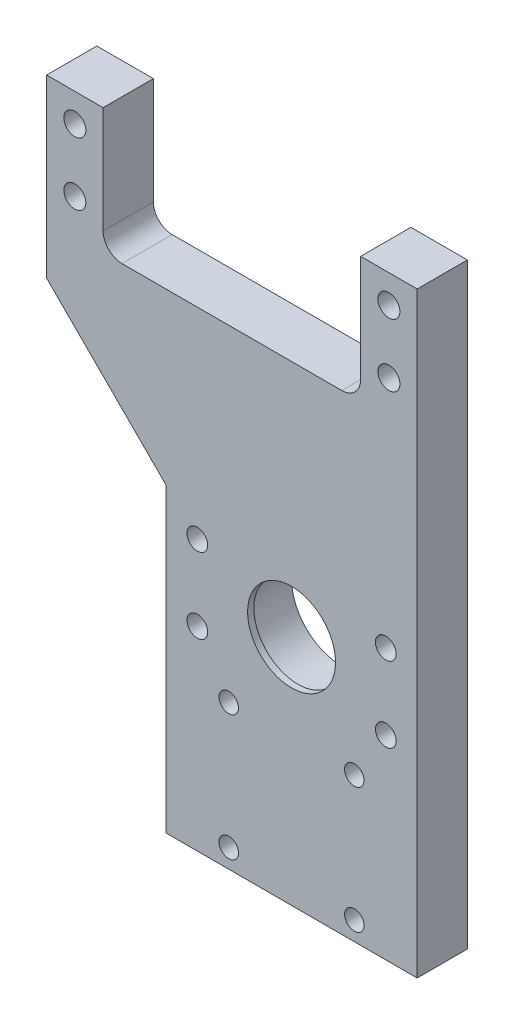
ISO-10303-21;
HEADER;
FILE_DESCRIPTION(('STEP AP214'),'2;1');
FILE_NAME('part.step','',(''),(''),'','','');
FILE_SCHEMA(('AUTOMOTIVE_DESIGN { 1 0 10303 214 1 1 1 1 }'));
ENDSEC;
DATA;
#1=APPLICATION_CONTEXT('core data for automotive mechanical design processes');
#2=APPLICATION_PROTOCOL_DEFINITION('international standard','automotive_design',2000,#1);
#3=PRODUCT_CONTEXT('',#1,'mechanical');
#4=PRODUCT('Part','Part','',(#3));
#5=PRODUCT_RELATED_PRODUCT_CATEGORY('part','',(#4));
#6=PRODUCT_DEFINITION_FORMATION('','',#4);
#7=PRODUCT_DEFINITION_CONTEXT('part definition',#1,'design');
#8=PRODUCT_DEFINITION('design','',#6,#7);
#9=PRODUCT_DEFINITION_SHAPE('','',#8);
#10=(LENGTH_UNIT() NAMED_UNIT(*) SI_UNIT(.MILLI.,.METRE.));
#11=(NAMED_UNIT(*) PLANE_ANGLE_UNIT() SI_UNIT($,.RADIAN.));
#12=(NAMED_UNIT(*) SI_UNIT($,.STERADIAN.) SOLID_ANGLE_UNIT());
#13=UNCERTAINTY_MEASURE_WITH_UNIT(LENGTH_MEASURE(1.E-05),#10,'distance_accuracy_value','');
#14=(GEOMETRIC_REPRESENTATION_CONTEXT(3) GLOBAL_UNCERTAINTY_ASSIGNED_CONTEXT((#13)) GLOBAL_UNIT_ASSIGNED_CONTEXT((#10,
#11,#12)) REPRESENTATION_CONTEXT('',''));
#15=CARTESIAN_POINT('',(0.,0.,0.));
#16=DIRECTION('',(0.,0.,1.));
#17=DIRECTION('',(1.,0.,0.));
#18=AXIS2_PLACEMENT_3D('',#15,#16,#17);
#19=CARTESIAN_POINT('',(0.,0.,8.));
#20=DIRECTION('',(1.,0.,0.));
#21=DIRECTION('',(0.,0.,-1.));
#22=AXIS2_PLACEMENT_3D('',#19,#20,#21);
#23=PLANE('',#22);
#24=DIRECTION('',(0.,-1.,0.));
#25=VECTOR('',#24,1.);
#26=CARTESIAN_POINT('',(0.,0.,8.));
#27=LINE('',#26,#25);
#28=CARTESIAN_POINT('',(0.,26.,8.));
#29=VERTEX_POINT('',#28);
#30=CARTESIAN_POINT('',(0.,-22.,8.));
#31=VERTEX_POINT('',#30);
#32=EDGE_CURVE('E223',#29,#31,#27,.T.);
#33=ORIENTED_EDGE('',*,*,#32,.F.);
#34=DIRECTION('',(0.,0.,-1.));
#35=VECTOR('',#34,1.);
#36=CARTESIAN_POINT('',(0.,26.,8.));
#37=LINE('',#36,#35);
#38=CARTESIAN_POINT('',(0.,26.,0.));
#39=VERTEX_POINT('',#38);
#40=EDGE_CURVE('E228',#29,#39,#37,.T.);
#41=ORIENTED_EDGE('',*,*,#40,.T.);
#42=DIRECTION('',(0.,-1.,0.));
#43=VECTOR('',#42,1.);
#44=CARTESIAN_POINT('',(0.,0.,0.));
#45=LINE('',#44,#43);
#46=CARTESIAN_POINT('',(0.,-22.,0.));
#47=VERTEX_POINT('',#46);
#48=EDGE_CURVE('E220',#39,#47,#45,.T.);
#49=ORIENTED_EDGE('',*,*,#48,.T.);
#50=DIRECTION('',(0.,0.,1.));
#51=VECTOR('',#50,1.);
#52=CARTESIAN_POINT('',(0.,-22.,0.));
#53=LINE('',#52,#51);
#54=EDGE_CURVE('E208',#47,#31,#53,.T.);
#55=ORIENTED_EDGE('',*,*,#54,.T.);
#56=EDGE_LOOP('',(#33,#41,#49,#55));
#57=FACE_BOUND('',#56,.T.);
#58=ADVANCED_FACE('F32',(#57),#23,.F.);
#59=CARTESIAN_POINT('',(40.,0.,8.));
#60=DIRECTION('',(-1.,0.,0.));
#61=DIRECTION('',(0.,0.,1.));
#62=AXIS2_PLACEMENT_3D('',#59,#60,#61);
#63=PLANE('',#62);
#64=DIRECTION('',(0.,1.,0.));
#65=VECTOR('',#64,1.);
#66=CARTESIAN_POINT('',(40.,0.,0.));
#67=LINE('',#66,#65);
#68=CARTESIAN_POINT('',(40.,-22.,0.));
#69=VERTEX_POINT('',#68);
#70=CARTESIAN_POINT('',(40.,73.,0.));
#71=VERTEX_POINT('',#70);
#72=EDGE_CURVE('E226',#69,#71,#67,.T.);
#73=ORIENTED_EDGE('',*,*,#72,.T.);
#74=DIRECTION('',(0.,0.,1.));
#75=VECTOR('',#74,1.);
#76=CARTESIAN_POINT('',(40.,73.,0.));
#77=LINE('',#76,#75);
#78=CARTESIAN_POINT('',(40.,73.,8.));
#79=VERTEX_POINT('',#78);
#80=EDGE_CURVE('E175',#71,#79,#77,.T.);
#81=ORIENTED_EDGE('',*,*,#80,.T.);
#82=DIRECTION('',(0.,1.,0.));
#83=VECTOR('',#82,1.);
#84=CARTESIAN_POINT('',(40.,0.,8.));
#85=LINE('',#84,#83);
#86=CARTESIAN_POINT('',(40.,-22.,8.));
#87=VERTEX_POINT('',#86);
#88=EDGE_CURVE('E225',#87,#79,#85,.T.);
#89=ORIENTED_EDGE('',*,*,#88,.F.);
#90=DIRECTION('',(0.,0.,1.));
#91=VECTOR('',#90,1.);
#92=CARTESIAN_POINT('',(40.,-22.,0.));
#93=LINE('',#92,#91);
#94=EDGE_CURVE('E211',#69,#87,#93,.T.);
#95=ORIENTED_EDGE('',*,*,#94,.F.);
#96=EDGE_LOOP('',(#73,#81,#89,#95));
#97=FACE_BOUND('',#96,.T.);
#98=ADVANCED_FACE('F266',(#97),#63,.F.);
#99=CARTESIAN_POINT('',(0.,0.,8.));
#100=DIRECTION('',(0.,0.,-1.));
#101=DIRECTION('',(-1.,0.,0.));
#102=AXIS2_PLACEMENT_3D('',#99,#100,#101);
#103=PLANE('',#102);
#104=CARTESIAN_POINT('',(5.,21.,8.));
#105=DIRECTION('',(0.,0.,-1.));
#106=DIRECTION('',(1.,0.,0.));
#107=AXIS2_PLACEMENT_3D('',#104,#105,#106);
#108=CIRCLE('',#107,1.65);
#109=CARTESIAN_POINT('',(6.65,21.,8.));
#110=VERTEX_POINT('',#109);
#111=EDGE_CURVE('E398',#110,#110,#108,.T.);
#112=ORIENTED_EDGE('',*,*,#111,.T.);
#113=EDGE_LOOP('',(#112));
#114=FACE_BOUND('',#113,.T.);
#115=CARTESIAN_POINT('',(5.,9.00000000000001,8.));
#116=DIRECTION('',(0.,0.,-1.));
#117=DIRECTION('',(-1.,0.,0.));
#118=AXIS2_PLACEMENT_3D('',#115,#116,#117);
#119=CIRCLE('',#118,1.65);
#120=CARTESIAN_POINT('',(3.34999999999999,9.00000000000001,8.));
#121=VERTEX_POINT('',#120);
#122=EDGE_CURVE('E402',#121,#121,#119,.T.);
#123=ORIENTED_EDGE('',*,*,#122,.T.);
#124=EDGE_LOOP('',(#123));
#125=FACE_BOUND('',#124,.T.);
#126=CARTESIAN_POINT('',(35.,9.00000000000001,8.));
#127=DIRECTION('',(0.,0.,-1.));
#128=DIRECTION('',(1.,0.,0.));
#129=AXIS2_PLACEMENT_3D('',#126,#127,#128);
#130=CIRCLE('',#129,1.65);
#131=CARTESIAN_POINT('',(36.65,9.00000000000001,8.));
#132=VERTEX_POINT('',#131);
#133=EDGE_CURVE('E412',#132,#132,#130,.T.);
#134=ORIENTED_EDGE('',*,*,#133,.T.);
#135=EDGE_LOOP('',(#134));
#136=FACE_BOUND('',#135,.T.);
#137=CARTESIAN_POINT('',(35.,21.,8.));
#138=DIRECTION('',(0.,0.,-1.));
#139=DIRECTION('',(-1.,0.,0.));
#140=AXIS2_PLACEMENT_3D('',#137,#138,#139);
#141=CIRCLE('',#140,1.65);
#142=CARTESIAN_POINT('',(33.35,21.,8.));
#143=VERTEX_POINT('',#142);
#144=EDGE_CURVE('E418',#143,#143,#141,.T.);
#145=ORIENTED_EDGE('',*,*,#144,.T.);
#146=EDGE_LOOP('',(#145));
#147=FACE_BOUND('',#146,.T.);
#148=CARTESIAN_POINT('',(20.,15.,8.));
#149=DIRECTION('',(0.,0.,-1.));
#150=DIRECTION('',(-1.,0.,0.));
#151=AXIS2_PLACEMENT_3D('',#148,#149,#150);
#152=CIRCLE('',#151,7.);
#153=CARTESIAN_POINT('',(13.,15.,8.));
#154=VERTEX_POINT('',#153);
#155=EDGE_CURVE('E436',#154,#154,#152,.T.);
#156=ORIENTED_EDGE('',*,*,#155,.T.);
#157=EDGE_LOOP('',(#156));
#158=FACE_BOUND('',#157,.T.);
#159=CARTESIAN_POINT('',(35.5,68.5,8.));
#160=DIRECTION('',(0.,0.,1.));
#161=DIRECTION('',(-1.,0.,0.));
#162=AXIS2_PLACEMENT_3D('',#159,#160,#161);
#163=CIRCLE('',#162,1.75);
#164=CARTESIAN_POINT('',(33.75,68.5,8.));
#165=VERTEX_POINT('',#164);
#166=EDGE_CURVE('E446',#165,#165,#163,.T.);
#167=ORIENTED_EDGE('',*,*,#166,.F.);
#168=EDGE_LOOP('',(#167));
#169=FACE_BOUND('',#168,.T.);
#170=CARTESIAN_POINT('',(-14.5,68.5,8.));
#171=DIRECTION('',(0.,0.,1.));
#172=DIRECTION('',(1.,0.,0.));
#173=AXIS2_PLACEMENT_3D('',#170,#171,#172);
#174=CIRCLE('',#173,1.75);
#175=CARTESIAN_POINT('',(-12.75,68.5,8.));
#176=VERTEX_POINT('',#175);
#177=EDGE_CURVE('E452',#176,#176,#174,.T.);
#178=ORIENTED_EDGE('',*,*,#177,.F.);
#179=EDGE_LOOP('',(#178));
#180=FACE_BOUND('',#179,.T.);
#181=CARTESIAN_POINT('',(-14.5,58.5,8.));
#182=DIRECTION('',(0.,0.,1.));
#183=DIRECTION('',(-1.,0.,0.));
#184=AXIS2_PLACEMENT_3D('',#181,#182,#183);
#185=CIRCLE('',#184,1.75);
#186=CARTESIAN_POINT('',(-16.25,58.5,8.));
#187=VERTEX_POINT('',#186);
#188=EDGE_CURVE('E439',#187,#187,#185,.T.);
#189=ORIENTED_EDGE('',*,*,#188,.F.);
#190=EDGE_LOOP('',(#189));
#191=FACE_BOUND('',#190,.T.);
#192=CARTESIAN_POINT('',(35.5,58.5,8.));
#193=DIRECTION('',(0.,0.,1.));
#194=DIRECTION('',(1.,0.,0.));
#195=AXIS2_PLACEMENT_3D('',#192,#193,#194);
#196=CIRCLE('',#195,1.75);
#197=CARTESIAN_POINT('',(37.25,58.5,8.));
#198=VERTEX_POINT('',#197);
#199=EDGE_CURVE('E445',#198,#198,#196,.T.);
#200=ORIENTED_EDGE('',*,*,#199,.F.);
#201=EDGE_LOOP('',(#200));
#202=FACE_BOUND('',#201,.T.);
#203=CARTESIAN_POINT('',(30.,1.,8.));
#204=DIRECTION('',(0.,0.,1.));
#205=DIRECTION('',(-1.,0.,0.));
#206=AXIS2_PLACEMENT_3D('',#203,#204,#205);
#207=CIRCLE('',#206,1.54999999999999);
#208=CARTESIAN_POINT('',(28.45,1.,8.));
#209=VERTEX_POINT('',#208);
#210=EDGE_CURVE('E185',#209,#209,#207,.T.);
#211=ORIENTED_EDGE('',*,*,#210,.F.);
#212=EDGE_LOOP('',(#211));
#213=FACE_BOUND('',#212,.T.);
#214=CARTESIAN_POINT('',(10.,1.,8.));
#215=DIRECTION('',(0.,0.,1.));
#216=DIRECTION('',(1.,0.,0.));
#217=AXIS2_PLACEMENT_3D('',#214,#215,#216);
#218=CIRCLE('',#217,1.55);
#219=CARTESIAN_POINT('',(11.55,1.,8.));
#220=VERTEX_POINT('',#219);
#221=EDGE_CURVE('E191',#220,#220,#218,.T.);
#222=ORIENTED_EDGE('',*,*,#221,.F.);
#223=EDGE_LOOP('',(#222));
#224=FACE_BOUND('',#223,.T.);
#225=CARTESIAN_POINT('',(10.,-19.,8.));
#226=DIRECTION('',(0.,0.,1.));
#227=DIRECTION('',(-1.,0.,0.));
#228=AXIS2_PLACEMENT_3D('',#225,#226,#227);
#229=CIRCLE('',#228,1.55);
#230=CARTESIAN_POINT('',(8.45,-19.,8.));
#231=VERTEX_POINT('',#230);
#232=EDGE_CURVE('E180',#231,#231,#229,.T.);
#233=ORIENTED_EDGE('',*,*,#232,.F.);
#234=EDGE_LOOP('',(#233));
#235=FACE_BOUND('',#234,.T.);
#236=CARTESIAN_POINT('',(30.,-19.,8.));
#237=DIRECTION('',(0.,0.,1.));
#238=DIRECTION('',(1.,0.,0.));
#239=AXIS2_PLACEMENT_3D('',#236,#237,#238);
#240=CIRCLE('',#239,1.54999999999999);
#241=CARTESIAN_POINT('',(31.55,-19.,8.));
#242=VERTEX_POINT('',#241);
#243=EDGE_CURVE('E184',#242,#242,#240,.T.);
#244=ORIENTED_EDGE('',*,*,#243,.F.);
#245=EDGE_LOOP('',(#244));
#246=FACE_BOUND('',#245,.T.);
#247=DIRECTION('',(-1.,0.,0.));
#248=VECTOR('',#247,1.);
#249=CARTESIAN_POINT('',(0.,73.,8.));
#250=LINE('',#249,#248);
#251=CARTESIAN_POINT('',(31.,73.,8.));
#252=VERTEX_POINT('',#251);
#253=EDGE_CURVE('E171',#79,#252,#250,.T.);
#254=ORIENTED_EDGE('',*,*,#253,.T.);
#255=DIRECTION('',(0.,1.,0.));
#256=VECTOR('',#255,1.);
#257=CARTESIAN_POINT('',(31.,73.,8.));
#258=LINE('',#257,#256);
#259=CARTESIAN_POINT('',(31.,56.,8.));
#260=VERTEX_POINT('',#259);
#261=EDGE_CURVE('E163',#260,#252,#258,.T.);
#262=ORIENTED_EDGE('',*,*,#261,.F.);
#263=CARTESIAN_POINT('',(28.,56.,8.));
#264=DIRECTION('',(0.,0.,-1.));
#265=DIRECTION('',(-1.,0.,0.));
#266=AXIS2_PLACEMENT_3D('',#263,#264,#265);
#267=CIRCLE('',#266,3.);
#268=CARTESIAN_POINT('',(28.,53.,8.));
#269=VERTEX_POINT('',#268);
#270=EDGE_CURVE('E40',#260,#269,#267,.T.);
#271=ORIENTED_EDGE('',*,*,#270,.T.);
#272=DIRECTION('',(1.,0.,0.));
#273=VECTOR('',#272,1.);
#274=CARTESIAN_POINT('',(0.,53.,8.));
#275=LINE('',#274,#273);
#276=CARTESIAN_POINT('',(-6.99999999999999,53.,8.));
#277=VERTEX_POINT('',#276);
#278=EDGE_CURVE('E158',#277,#269,#275,.T.);
#279=ORIENTED_EDGE('',*,*,#278,.F.);
#280=CARTESIAN_POINT('',(-6.99999999999999,56.,8.));
#281=DIRECTION('',(0.,0.,-1.));
#282=DIRECTION('',(-1.,0.,0.));
#283=AXIS2_PLACEMENT_3D('',#280,#281,#282);
#284=CIRCLE('',#283,3.);
#285=CARTESIAN_POINT('',(-9.99999999999999,56.,8.));
#286=VERTEX_POINT('',#285);
#287=EDGE_CURVE('E244',#277,#286,#284,.T.);
#288=ORIENTED_EDGE('',*,*,#287,.T.);
#289=DIRECTION('',(0.,1.,0.));
#290=VECTOR('',#289,1.);
#291=CARTESIAN_POINT('',(-9.99999999999999,53.,8.));
#292=LINE('',#291,#290);
#293=CARTESIAN_POINT('',(-9.99999999999999,73.,8.));
#294=VERTEX_POINT('',#293);
#295=EDGE_CURVE('E149',#286,#294,#292,.T.);
#296=ORIENTED_EDGE('',*,*,#295,.T.);
#297=DIRECTION('',(-1.,0.,0.));
#298=VECTOR('',#297,1.);
#299=CARTESIAN_POINT('',(-9.99999999999999,73.,8.));
#300=LINE('',#299,#298);
#301=CARTESIAN_POINT('',(-19.,73.,8.));
#302=VERTEX_POINT('',#301);
#303=EDGE_CURVE('E137',#294,#302,#300,.T.);
#304=ORIENTED_EDGE('',*,*,#303,.T.);
#305=DIRECTION('',(0.,-1.,0.));
#306=VECTOR('',#305,1.);
#307=CARTESIAN_POINT('',(-19.,73.,8.));
#308=LINE('',#307,#306);
#309=CARTESIAN_POINT('',(-19.,45.,8.));
#310=VERTEX_POINT('',#309);
#311=EDGE_CURVE('E131',#302,#310,#308,.T.);
#312=ORIENTED_EDGE('',*,*,#311,.T.);
#313=DIRECTION('',(0.707106781186551,-0.707106781186544,0.));
#314=VECTOR('',#313,1.);
#315=CARTESIAN_POINT('',(13.,13.0000000000002,8.));
#316=LINE('',#315,#314);
#317=EDGE_CURVE('E232',#310,#29,#316,.T.);
#318=ORIENTED_EDGE('',*,*,#317,.T.);
#319=ORIENTED_EDGE('',*,*,#32,.T.);
#320=DIRECTION('',(1.,0.,0.));
#321=VECTOR('',#320,1.);
#322=CARTESIAN_POINT('',(0.,-22.,8.));
#323=LINE('',#322,#321);
#324=EDGE_CURVE('E202',#31,#87,#323,.T.);
#325=ORIENTED_EDGE('',*,*,#324,.T.);
#326=ORIENTED_EDGE('',*,*,#88,.T.);
#327=EDGE_LOOP('',(#254,#262,#271,#279,#288,#296,#304,#312,#318,#319,#325,#326));
#328=FACE_BOUND('',#327,.T.);
#329=ADVANCED_FACE('F250',(#114,#125,#136,#147,#158,#169,#180,#191,#202,#213,#224,#235,#246,
#328),#103,.F.);
#330=CARTESIAN_POINT('',(0.,0.,0.));
#331=DIRECTION('',(0.,0.,-1.));
#332=DIRECTION('',(-1.,0.,0.));
#333=AXIS2_PLACEMENT_3D('',#330,#331,#332);
#334=PLANE('',#333);
#335=CARTESIAN_POINT('',(5.,21.,0.));
#336=DIRECTION('',(0.,0.,-1.));
#337=DIRECTION('',(1.,0.,0.));
#338=AXIS2_PLACEMENT_3D('',#335,#336,#337);
#339=CIRCLE('',#338,1.65);
#340=CARTESIAN_POINT('',(6.65,21.,0.));
#341=VERTEX_POINT('',#340);
#342=EDGE_CURVE('E401',#341,#341,#339,.T.);
#343=ORIENTED_EDGE('',*,*,#342,.F.);
#344=EDGE_LOOP('',(#343));
#345=FACE_BOUND('',#344,.T.);
#346=CARTESIAN_POINT('',(5.,9.00000000000001,0.));
#347=DIRECTION('',(0.,0.,-1.));
#348=DIRECTION('',(-1.,0.,0.));
#349=AXIS2_PLACEMENT_3D('',#346,#347,#348);
#350=CIRCLE('',#349,1.65);
#351=CARTESIAN_POINT('',(3.34999999999999,9.00000000000001,0.));
#352=VERTEX_POINT('',#351);
#353=EDGE_CURVE('E407',#352,#352,#350,.T.);
#354=ORIENTED_EDGE('',*,*,#353,.F.);
#355=EDGE_LOOP('',(#354));
#356=FACE_BOUND('',#355,.T.);
#357=CARTESIAN_POINT('',(35.,9.00000000000001,0.));
#358=DIRECTION('',(0.,0.,-1.));
#359=DIRECTION('',(1.,0.,0.));
#360=AXIS2_PLACEMENT_3D('',#357,#358,#359);
#361=CIRCLE('',#360,1.65);
#362=CARTESIAN_POINT('',(36.65,9.00000000000001,0.));
#363=VERTEX_POINT('',#362);
#364=EDGE_CURVE('E415',#363,#363,#361,.T.);
#365=ORIENTED_EDGE('',*,*,#364,.F.);
#366=EDGE_LOOP('',(#365));
#367=FACE_BOUND('',#366,.T.);
#368=CARTESIAN_POINT('',(35.,21.,0.));
#369=DIRECTION('',(0.,0.,-1.));
#370=DIRECTION('',(-1.,0.,0.));
#371=AXIS2_PLACEMENT_3D('',#368,#369,#370);
#372=CIRCLE('',#371,1.65);
#373=CARTESIAN_POINT('',(33.35,21.,0.));
#374=VERTEX_POINT('',#373);
#375=EDGE_CURVE('E404',#374,#374,#372,.T.);
#376=ORIENTED_EDGE('',*,*,#375,.F.);
#377=EDGE_LOOP('',(#376));
#378=FACE_BOUND('',#377,.T.);
#379=CARTESIAN_POINT('',(35.5,68.5,0.));
#380=DIRECTION('',(0.,0.,1.));
#381=DIRECTION('',(-1.,0.,0.));
#382=AXIS2_PLACEMENT_3D('',#379,#380,#381);
#383=CIRCLE('',#382,1.75);
#384=CARTESIAN_POINT('',(33.75,68.5,0.));
#385=VERTEX_POINT('',#384);
#386=EDGE_CURVE('E442',#385,#385,#383,.T.);
#387=ORIENTED_EDGE('',*,*,#386,.T.);
#388=EDGE_LOOP('',(#387));
#389=FACE_BOUND('',#388,.T.);
#390=CARTESIAN_POINT('',(-14.5,68.5,0.));
#391=DIRECTION('',(0.,0.,1.));
#392=DIRECTION('',(1.,0.,0.));
#393=AXIS2_PLACEMENT_3D('',#390,#391,#392);
#394=CIRCLE('',#393,1.75);
#395=CARTESIAN_POINT('',(-12.75,68.5,0.));
#396=VERTEX_POINT('',#395);
#397=EDGE_CURVE('E449',#396,#396,#394,.T.);
#398=ORIENTED_EDGE('',*,*,#397,.T.);
#399=EDGE_LOOP('',(#398));
#400=FACE_BOUND('',#399,.T.);
#401=CARTESIAN_POINT('',(-14.5,58.5,0.));
#402=DIRECTION('',(0.,0.,1.));
#403=DIRECTION('',(-1.,0.,0.));
#404=AXIS2_PLACEMENT_3D('',#401,#402,#403);
#405=CIRCLE('',#404,1.75);
#406=CARTESIAN_POINT('',(-16.25,58.5,0.));
#407=VERTEX_POINT('',#406);
#408=EDGE_CURVE('E455',#407,#407,#405,.T.);
#409=ORIENTED_EDGE('',*,*,#408,.T.);
#410=EDGE_LOOP('',(#409));
#411=FACE_BOUND('',#410,.T.);
#412=CARTESIAN_POINT('',(35.5,58.5,0.));
#413=DIRECTION('',(0.,0.,1.));
#414=DIRECTION('',(1.,0.,0.));
#415=AXIS2_PLACEMENT_3D('',#412,#413,#414);
#416=CIRCLE('',#415,1.75);
#417=CARTESIAN_POINT('',(37.25,58.5,0.));
#418=VERTEX_POINT('',#417);
#419=EDGE_CURVE('E151',#418,#418,#416,.T.);
#420=ORIENTED_EDGE('',*,*,#419,.T.);
#421=EDGE_LOOP('',(#420));
#422=FACE_BOUND('',#421,.T.);
#423=DIRECTION('',(1.,0.,0.));
#424=VECTOR('',#423,1.);
#425=CARTESIAN_POINT('',(0.,53.,0.));
#426=LINE('',#425,#424);
#427=CARTESIAN_POINT('',(-6.99999999999999,53.,0.));
#428=VERTEX_POINT('',#427);
#429=CARTESIAN_POINT('',(28.,53.,0.));
#430=VERTEX_POINT('',#429);
#431=EDGE_CURVE('E160',#428,#430,#426,.T.);
#432=ORIENTED_EDGE('',*,*,#431,.T.);
#433=CARTESIAN_POINT('',(28.,56.,0.));
#434=DIRECTION('',(0.,0.,-1.));
#435=DIRECTION('',(-1.,0.,0.));
#436=AXIS2_PLACEMENT_3D('',#433,#434,#435);
#437=CIRCLE('',#436,3.);
#438=CARTESIAN_POINT('',(31.,56.,0.));
#439=VERTEX_POINT('',#438);
#440=EDGE_CURVE('E11',#430,#439,#437,.F.);
#441=ORIENTED_EDGE('',*,*,#440,.T.);
#442=DIRECTION('',(0.,1.,0.));
#443=VECTOR('',#442,1.);
#444=CARTESIAN_POINT('',(31.,73.,0.));
#445=LINE('',#444,#443);
#446=CARTESIAN_POINT('',(31.,73.,0.));
#447=VERTEX_POINT('',#446);
#448=EDGE_CURVE('E162',#439,#447,#445,.T.);
#449=ORIENTED_EDGE('',*,*,#448,.T.);
#450=DIRECTION('',(-1.,0.,0.));
#451=VECTOR('',#450,1.);
#452=CARTESIAN_POINT('',(0.,73.,0.));
#453=LINE('',#452,#451);
#454=EDGE_CURVE('E172',#71,#447,#453,.T.);
#455=ORIENTED_EDGE('',*,*,#454,.F.);
#456=ORIENTED_EDGE('',*,*,#72,.F.);
#457=DIRECTION('',(1.,0.,0.));
#458=VECTOR('',#457,1.);
#459=CARTESIAN_POINT('',(0.,-22.,0.));
#460=LINE('',#459,#458);
#461=EDGE_CURVE('E205',#47,#69,#460,.T.);
#462=ORIENTED_EDGE('',*,*,#461,.F.);
#463=ORIENTED_EDGE('',*,*,#48,.F.);
#464=DIRECTION('',(-0.707106781186551,0.707106781186544,0.));
#465=VECTOR('',#464,1.);
#466=CARTESIAN_POINT('',(-19.0000000000001,45.,0.));
#467=LINE('',#466,#465);
#468=CARTESIAN_POINT('',(-19.,45.,0.));
#469=VERTEX_POINT('',#468);
#470=EDGE_CURVE('E234',#39,#469,#467,.T.);
#471=ORIENTED_EDGE('',*,*,#470,.T.);
#472=DIRECTION('',(0.,-1.,0.));
#473=VECTOR('',#472,1.);
#474=CARTESIAN_POINT('',(-19.,73.,0.));
#475=LINE('',#474,#473);
#476=CARTESIAN_POINT('',(-19.,73.,0.));
#477=VERTEX_POINT('',#476);
#478=EDGE_CURVE('E139',#477,#469,#475,.T.);
#479=ORIENTED_EDGE('',*,*,#478,.F.);
#480=DIRECTION('',(-1.,0.,0.));
#481=VECTOR('',#480,1.);
#482=CARTESIAN_POINT('',(-9.99999999999999,73.,0.));
#483=LINE('',#482,#481);
#484=CARTESIAN_POINT('',(-9.99999999999999,73.,0.));
#485=VERTEX_POINT('',#484);
#486=EDGE_CURVE('E130',#485,#477,#483,.T.);
#487=ORIENTED_EDGE('',*,*,#486,.F.);
#488=DIRECTION('',(0.,1.,0.));
#489=VECTOR('',#488,1.);
#490=CARTESIAN_POINT('',(-9.99999999999999,53.,0.));
#491=LINE('',#490,#489);
#492=CARTESIAN_POINT('',(-9.99999999999999,56.,0.));
#493=VERTEX_POINT('',#492);
#494=EDGE_CURVE('E120',#493,#485,#491,.T.);
#495=ORIENTED_EDGE('',*,*,#494,.F.);
#496=CARTESIAN_POINT('',(-6.99999999999999,56.,0.));
#497=DIRECTION('',(0.,0.,-1.));
#498=DIRECTION('',(-1.,0.,0.));
#499=AXIS2_PLACEMENT_3D('',#496,#497,#498);
#500=CIRCLE('',#499,3.);
#501=EDGE_CURVE('E246',#493,#428,#500,.F.);
#502=ORIENTED_EDGE('',*,*,#501,.T.);
#503=EDGE_LOOP('',(#432,#441,#449,#455,#456,#462,#463,#471,#479,#487,#495,#502));
#504=FACE_BOUND('',#503,.T.);
#505=CARTESIAN_POINT('',(30.,1.,0.));
#506=DIRECTION('',(0.,0.,1.));
#507=DIRECTION('',(-1.,0.,0.));
#508=AXIS2_PLACEMENT_3D('',#505,#506,#507);
#509=CIRCLE('',#508,1.54999999999999);
#510=CARTESIAN_POINT('',(28.45,1.,0.));
#511=VERTEX_POINT('',#510);
#512=EDGE_CURVE('E181',#511,#511,#509,.T.);
#513=ORIENTED_EDGE('',*,*,#512,.T.);
#514=EDGE_LOOP('',(#513));
#515=FACE_BOUND('',#514,.T.);
#516=CARTESIAN_POINT('',(10.,1.,0.));
#517=DIRECTION('',(0.,0.,1.));
#518=DIRECTION('',(1.,0.,0.));
#519=AXIS2_PLACEMENT_3D('',#516,#517,#518);
#520=CIRCLE('',#519,1.55);
#521=CARTESIAN_POINT('',(11.55,1.,0.));
#522=VERTEX_POINT('',#521);
#523=EDGE_CURVE('E188',#522,#522,#520,.T.);
#524=ORIENTED_EDGE('',*,*,#523,.T.);
#525=EDGE_LOOP('',(#524));
#526=FACE_BOUND('',#525,.T.);
#527=CARTESIAN_POINT('',(10.,-19.,0.));
#528=DIRECTION('',(0.,0.,1.));
#529=DIRECTION('',(-1.,0.,0.));
#530=AXIS2_PLACEMENT_3D('',#527,#528,#529);
#531=CIRCLE('',#530,1.55);
#532=CARTESIAN_POINT('',(8.45,-19.,0.));
#533=VERTEX_POINT('',#532);
#534=EDGE_CURVE('E194',#533,#533,#531,.T.);
#535=ORIENTED_EDGE('',*,*,#534,.T.);
#536=EDGE_LOOP('',(#535));
#537=FACE_BOUND('',#536,.T.);
#538=CARTESIAN_POINT('',(30.,-19.,0.));
#539=DIRECTION('',(0.,0.,1.));
#540=DIRECTION('',(1.,0.,0.));
#541=AXIS2_PLACEMENT_3D('',#538,#539,#540);
#542=CIRCLE('',#541,1.54999999999999);
#543=CARTESIAN_POINT('',(31.55,-19.,0.));
#544=VERTEX_POINT('',#543);
#545=EDGE_CURVE('E199',#544,#544,#542,.T.);
#546=ORIENTED_EDGE('',*,*,#545,.T.);
#547=EDGE_LOOP('',(#546));
#548=FACE_BOUND('',#547,.T.);
#549=CARTESIAN_POINT('',(20.,15.,0.));
#550=DIRECTION('',(0.,0.,1.));
#551=DIRECTION('',(1.,0.,0.));
#552=AXIS2_PLACEMENT_3D('',#549,#550,#551);
#553=CIRCLE('',#552,8.);
#554=CARTESIAN_POINT('',(28.,15.,0.));
#555=VERTEX_POINT('',#554);
#556=EDGE_CURVE('E214',#555,#555,#553,.T.);
#557=ORIENTED_EDGE('',*,*,#556,.T.);
#558=EDGE_LOOP('',(#557));
#559=FACE_BOUND('',#558,.T.);
#560=ADVANCED_FACE('F142',(#345,#356,#367,#378,#389,#400,#411,#422,#504,#515,#526,#537,#548,
#559),#334,.T.);
#561=CARTESIAN_POINT('',(20.,15.,7.));
#562=DIRECTION('',(0.,0.,-1.));
#563=DIRECTION('',(-1.,0.,0.));
#564=AXIS2_PLACEMENT_3D('',#561,#562,#563);
#565=CYLINDRICAL_SURFACE('',#564,8.);
#566=CARTESIAN_POINT('',(20.,15.,7.));
#567=DIRECTION('',(0.,0.,1.));
#568=DIRECTION('',(1.,0.,0.));
#569=AXIS2_PLACEMENT_3D('',#566,#567,#568);
#570=CIRCLE('',#569,8.);
#571=CARTESIAN_POINT('',(28.,15.,7.));
#572=VERTEX_POINT('',#571);
#573=EDGE_CURVE('E217',#572,#572,#570,.T.);
#574=ORIENTED_EDGE('',*,*,#573,.T.);
#575=EDGE_LOOP('',(#574));
#576=FACE_BOUND('',#575,.T.);
#577=ORIENTED_EDGE('',*,*,#556,.F.);
#578=EDGE_LOOP('',(#577));
#579=FACE_BOUND('',#578,.T.);
#580=ADVANCED_FACE('F300',(#576,#579),#565,.F.);
#581=CARTESIAN_POINT('',(20.,15.,7.));
#582=DIRECTION('',(0.,0.,1.));
#583=DIRECTION('',(1.,0.,0.));
#584=AXIS2_PLACEMENT_3D('',#581,#582,#583);
#585=PLANE('',#584);
#586=CARTESIAN_POINT('',(20.,15.,7.));
#587=DIRECTION('',(0.,0.,-1.));
#588=DIRECTION('',(-1.,0.,0.));
#589=AXIS2_PLACEMENT_3D('',#586,#587,#588);
#590=CIRCLE('',#589,7.);
#591=CARTESIAN_POINT('',(13.,15.,7.));
#592=VERTEX_POINT('',#591);
#593=EDGE_CURVE('E433',#592,#592,#590,.T.);
#594=ORIENTED_EDGE('',*,*,#593,.F.);
#595=EDGE_LOOP('',(#594));
#596=FACE_BOUND('',#595,.T.);
#597=ORIENTED_EDGE('',*,*,#573,.F.);
#598=EDGE_LOOP('',(#597));
#599=FACE_BOUND('',#598,.T.);
#600=ADVANCED_FACE('F307',(#596,#599),#585,.F.);
#601=CARTESIAN_POINT('',(0.,-22.,0.));
#602=DIRECTION('',(0.,-1.,0.));
#603=DIRECTION('',(0.,0.,-1.));
#604=AXIS2_PLACEMENT_3D('',#601,#602,#603);
#605=PLANE('',#604);
#606=CARTESIAN_POINT('',(36.,-22.,4.));
#607=DIRECTION('',(0.,-1.,0.));
#608=DIRECTION('',(0.,0.,-1.));
#609=AXIS2_PLACEMENT_3D('',#606,#607,#608);
#610=CIRCLE('',#609,1.65);
#611=CARTESIAN_POINT('',(36.,-22.,2.35));
#612=VERTEX_POINT('',#611);
#613=EDGE_CURVE('E421',#612,#612,#610,.T.);
#614=ORIENTED_EDGE('',*,*,#613,.F.);
#615=EDGE_LOOP('',(#614));
#616=FACE_BOUND('',#615,.T.);
#617=CARTESIAN_POINT('',(20.,-22.,4.));
#618=DIRECTION('',(0.,-1.,0.));
#619=DIRECTION('',(0.,0.,-1.));
#620=AXIS2_PLACEMENT_3D('',#617,#618,#619);
#621=CIRCLE('',#620,1.65);
#622=CARTESIAN_POINT('',(20.,-22.,2.35));
#623=VERTEX_POINT('',#622);
#624=EDGE_CURVE('E427',#623,#623,#621,.T.);
#625=ORIENTED_EDGE('',*,*,#624,.F.);
#626=EDGE_LOOP('',(#625));
#627=FACE_BOUND('',#626,.T.);
#628=ORIENTED_EDGE('',*,*,#324,.F.);
#629=ORIENTED_EDGE('',*,*,#54,.F.);
#630=ORIENTED_EDGE('',*,*,#461,.T.);
#631=ORIENTED_EDGE('',*,*,#94,.T.);
#632=EDGE_LOOP('',(#628,#629,#630,#631));
#633=FACE_BOUND('',#632,.T.);
#634=ADVANCED_FACE('F270',(#616,#627,#633),#605,.T.);
#635=CARTESIAN_POINT('',(30.,-19.,0.));
#636=DIRECTION('',(0.,0.,1.));
#637=DIRECTION('',(1.,0.,0.));
#638=AXIS2_PLACEMENT_3D('',#635,#636,#637);
#639=CYLINDRICAL_SURFACE('',#638,1.54999999999999);
#640=ORIENTED_EDGE('',*,*,#545,.F.);
#641=EDGE_LOOP('',(#640));
#642=FACE_BOUND('',#641,.T.);
#643=ORIENTED_EDGE('',*,*,#243,.T.);
#644=EDGE_LOOP('',(#643));
#645=FACE_BOUND('',#644,.T.);
#646=ADVANCED_FACE('F314',(#642,#645),#639,.F.);
#647=CARTESIAN_POINT('',(10.,-19.,0.));
#648=DIRECTION('',(0.,0.,1.));
#649=DIRECTION('',(1.,0.,0.));
#650=AXIS2_PLACEMENT_3D('',#647,#648,#649);
#651=CYLINDRICAL_SURFACE('',#650,1.55);
#652=ORIENTED_EDGE('',*,*,#534,.F.);
#653=EDGE_LOOP('',(#652));
#654=FACE_BOUND('',#653,.T.);
#655=ORIENTED_EDGE('',*,*,#232,.T.);
#656=EDGE_LOOP('',(#655));
#657=FACE_BOUND('',#656,.T.);
#658=ADVANCED_FACE('F318',(#654,#657),#651,.F.);
#659=CARTESIAN_POINT('',(10.,1.,0.));
#660=DIRECTION('',(0.,0.,1.));
#661=DIRECTION('',(1.,0.,0.));
#662=AXIS2_PLACEMENT_3D('',#659,#660,#661);
#663=CYLINDRICAL_SURFACE('',#662,1.55);
#664=ORIENTED_EDGE('',*,*,#523,.F.);
#665=EDGE_LOOP('',(#664));
#666=FACE_BOUND('',#665,.T.);
#667=ORIENTED_EDGE('',*,*,#221,.T.);
#668=EDGE_LOOP('',(#667));
#669=FACE_BOUND('',#668,.T.);
#670=ADVANCED_FACE('F322',(#666,#669),#663,.F.);
#671=CARTESIAN_POINT('',(30.,1.,0.));
#672=DIRECTION('',(0.,0.,1.));
#673=DIRECTION('',(1.,0.,0.));
#674=AXIS2_PLACEMENT_3D('',#671,#672,#673);
#675=CYLINDRICAL_SURFACE('',#674,1.54999999999999);
#676=ORIENTED_EDGE('',*,*,#512,.F.);
#677=EDGE_LOOP('',(#676));
#678=FACE_BOUND('',#677,.T.);
#679=ORIENTED_EDGE('',*,*,#210,.T.);
#680=EDGE_LOOP('',(#679));
#681=FACE_BOUND('',#680,.T.);
#682=ADVANCED_FACE('F326',(#678,#681),#675,.F.);
#683=CARTESIAN_POINT('',(0.,73.,0.));
#684=DIRECTION('',(0.,1.,0.));
#685=DIRECTION('',(0.,0.,1.));
#686=AXIS2_PLACEMENT_3D('',#683,#684,#685);
#687=PLANE('',#686);
#688=DIRECTION('',(0.,0.,1.));
#689=VECTOR('',#688,1.);
#690=CARTESIAN_POINT('',(31.,73.,0.));
#691=LINE('',#690,#689);
#692=EDGE_CURVE('E165',#447,#252,#691,.T.);
#693=ORIENTED_EDGE('',*,*,#692,.T.);
#694=ORIENTED_EDGE('',*,*,#253,.F.);
#695=ORIENTED_EDGE('',*,*,#80,.F.);
#696=ORIENTED_EDGE('',*,*,#454,.T.);
#697=EDGE_LOOP('',(#693,#694,#695,#696));
#698=FACE_BOUND('',#697,.T.);
#699=ADVANCED_FACE('F263',(#698),#687,.T.);
#700=CARTESIAN_POINT('',(31.,73.,0.));
#701=DIRECTION('',(1.,0.,0.));
#702=DIRECTION('',(0.,1.,0.));
#703=AXIS2_PLACEMENT_3D('',#700,#701,#702);
#704=PLANE('',#703);
#705=ORIENTED_EDGE('',*,*,#448,.F.);
#706=DIRECTION('',(0.,0.,1.));
#707=VECTOR('',#706,1.);
#708=CARTESIAN_POINT('',(31.,56.,8.));
#709=LINE('',#708,#707);
#710=EDGE_CURVE('E242',#439,#260,#709,.T.);
#711=ORIENTED_EDGE('',*,*,#710,.T.);
#712=ORIENTED_EDGE('',*,*,#261,.T.);
#713=ORIENTED_EDGE('',*,*,#692,.F.);
#714=EDGE_LOOP('',(#705,#711,#712,#713));
#715=FACE_BOUND('',#714,.T.);
#716=ADVANCED_FACE('F256',(#715),#704,.F.);
#717=CARTESIAN_POINT('',(0.,53.,0.));
#718=DIRECTION('',(0.,-1.,0.));
#719=DIRECTION('',(0.,0.,-1.));
#720=AXIS2_PLACEMENT_3D('',#717,#718,#719);
#721=PLANE('',#720);
#722=ORIENTED_EDGE('',*,*,#431,.F.);
#723=DIRECTION('',(0.,0.,1.));
#724=VECTOR('',#723,1.);
#725=CARTESIAN_POINT('',(-6.99999999999999,53.,0.));
#726=LINE('',#725,#724);
#727=EDGE_CURVE('E238',#428,#277,#726,.T.);
#728=ORIENTED_EDGE('',*,*,#727,.T.);
#729=ORIENTED_EDGE('',*,*,#278,.T.);
#730=DIRECTION('',(0.,0.,1.));
#731=VECTOR('',#730,1.);
#732=CARTESIAN_POINT('',(28.,53.,0.));
#733=LINE('',#732,#731);
#734=EDGE_CURVE('E236',#269,#430,#733,.F.);
#735=ORIENTED_EDGE('',*,*,#734,.T.);
#736=EDGE_LOOP('',(#722,#728,#729,#735));
#737=FACE_BOUND('',#736,.T.);
#738=ADVANCED_FACE('F253',(#737),#721,.F.);
#739=CARTESIAN_POINT('',(-19.,73.,0.));
#740=DIRECTION('',(-1.,0.,0.));
#741=DIRECTION('',(0.,-1.,0.));
#742=AXIS2_PLACEMENT_3D('',#739,#740,#741);
#743=PLANE('',#742);
#744=ORIENTED_EDGE('',*,*,#311,.F.);
#745=DIRECTION('',(0.,0.,1.));
#746=VECTOR('',#745,1.);
#747=CARTESIAN_POINT('',(-19.,73.,0.));
#748=LINE('',#747,#746);
#749=EDGE_CURVE('E138',#477,#302,#748,.T.);
#750=ORIENTED_EDGE('',*,*,#749,.F.);
#751=ORIENTED_EDGE('',*,*,#478,.T.);
#752=DIRECTION('',(0.,0.,1.));
#753=VECTOR('',#752,1.);
#754=CARTESIAN_POINT('',(-19.,45.,0.));
#755=LINE('',#754,#753);
#756=EDGE_CURVE('E155',#469,#310,#755,.T.);
#757=ORIENTED_EDGE('',*,*,#756,.T.);
#758=EDGE_LOOP('',(#744,#750,#751,#757));
#759=FACE_BOUND('',#758,.T.);
#760=ADVANCED_FACE('F280',(#759),#743,.T.);
#761=CARTESIAN_POINT('',(-9.99999999999999,73.,0.));
#762=DIRECTION('',(0.,1.,0.));
#763=DIRECTION('',(-1.,0.,0.));
#764=AXIS2_PLACEMENT_3D('',#761,#762,#763);
#765=PLANE('',#764);
#766=ORIENTED_EDGE('',*,*,#303,.F.);
#767=DIRECTION('',(0.,0.,1.));
#768=VECTOR('',#767,1.);
#769=CARTESIAN_POINT('',(-9.99999999999999,73.,0.));
#770=LINE('',#769,#768);
#771=EDGE_CURVE('E124',#485,#294,#770,.T.);
#772=ORIENTED_EDGE('',*,*,#771,.F.);
#773=ORIENTED_EDGE('',*,*,#486,.T.);
#774=ORIENTED_EDGE('',*,*,#749,.T.);
#775=EDGE_LOOP('',(#766,#772,#773,#774));
#776=FACE_BOUND('',#775,.T.);
#777=ADVANCED_FACE('F135',(#776),#765,.T.);
#778=CARTESIAN_POINT('',(-9.99999999999999,53.,0.));
#779=DIRECTION('',(1.,0.,0.));
#780=DIRECTION('',(0.,0.,-1.));
#781=AXIS2_PLACEMENT_3D('',#778,#779,#780);
#782=PLANE('',#781);
#783=ORIENTED_EDGE('',*,*,#295,.F.);
#784=DIRECTION('',(0.,0.,1.));
#785=VECTOR('',#784,1.);
#786=CARTESIAN_POINT('',(-9.99999999999999,56.,0.));
#787=LINE('',#786,#785);
#788=EDGE_CURVE('E127',#286,#493,#787,.F.);
#789=ORIENTED_EDGE('',*,*,#788,.T.);
#790=ORIENTED_EDGE('',*,*,#494,.T.);
#791=ORIENTED_EDGE('',*,*,#771,.T.);
#792=EDGE_LOOP('',(#783,#789,#790,#791));
#793=FACE_BOUND('',#792,.T.);
#794=ADVANCED_FACE('F123',(#793),#782,.T.);
#795=CARTESIAN_POINT('',(35.5,58.5,0.));
#796=DIRECTION('',(0.,0.,1.));
#797=DIRECTION('',(1.,0.,0.));
#798=AXIS2_PLACEMENT_3D('',#795,#796,#797);
#799=CYLINDRICAL_SURFACE('',#798,1.75);
#800=ORIENTED_EDGE('',*,*,#419,.F.);
#801=EDGE_LOOP('',(#800));
#802=FACE_BOUND('',#801,.T.);
#803=ORIENTED_EDGE('',*,*,#199,.T.);
#804=EDGE_LOOP('',(#803));
#805=FACE_BOUND('',#804,.T.);
#806=ADVANCED_FACE('F339',(#802,#805),#799,.F.);
#807=CARTESIAN_POINT('',(-14.5,58.5,0.));
#808=DIRECTION('',(0.,0.,1.));
#809=DIRECTION('',(1.,0.,0.));
#810=AXIS2_PLACEMENT_3D('',#807,#808,#809);
#811=CYLINDRICAL_SURFACE('',#810,1.75);
#812=ORIENTED_EDGE('',*,*,#408,.F.);
#813=EDGE_LOOP('',(#812));
#814=FACE_BOUND('',#813,.T.);
#815=ORIENTED_EDGE('',*,*,#188,.T.);
#816=EDGE_LOOP('',(#815));
#817=FACE_BOUND('',#816,.T.);
#818=ADVANCED_FACE('F346',(#814,#817),#811,.F.);
#819=CARTESIAN_POINT('',(-14.5,68.5,0.));
#820=DIRECTION('',(0.,0.,1.));
#821=DIRECTION('',(1.,0.,0.));
#822=AXIS2_PLACEMENT_3D('',#819,#820,#821);
#823=CYLINDRICAL_SURFACE('',#822,1.75);
#824=ORIENTED_EDGE('',*,*,#397,.F.);
#825=EDGE_LOOP('',(#824));
#826=FACE_BOUND('',#825,.T.);
#827=ORIENTED_EDGE('',*,*,#177,.T.);
#828=EDGE_LOOP('',(#827));
#829=FACE_BOUND('',#828,.T.);
#830=ADVANCED_FACE('F350',(#826,#829),#823,.F.);
#831=CARTESIAN_POINT('',(35.5,68.5,0.));
#832=DIRECTION('',(0.,0.,1.));
#833=DIRECTION('',(1.,0.,0.));
#834=AXIS2_PLACEMENT_3D('',#831,#832,#833);
#835=CYLINDRICAL_SURFACE('',#834,1.75);
#836=ORIENTED_EDGE('',*,*,#386,.F.);
#837=EDGE_LOOP('',(#836));
#838=FACE_BOUND('',#837,.T.);
#839=ORIENTED_EDGE('',*,*,#166,.T.);
#840=EDGE_LOOP('',(#839));
#841=FACE_BOUND('',#840,.T.);
#842=ADVANCED_FACE('F354',(#838,#841),#835,.F.);
#843=CARTESIAN_POINT('',(20.,15.,8.));
#844=DIRECTION('',(0.,0.,-1.));
#845=DIRECTION('',(-1.,0.,0.));
#846=AXIS2_PLACEMENT_3D('',#843,#844,#845);
#847=CYLINDRICAL_SURFACE('',#846,7.);
#848=ORIENTED_EDGE('',*,*,#155,.F.);
#849=EDGE_LOOP('',(#848));
#850=FACE_BOUND('',#849,.T.);
#851=ORIENTED_EDGE('',*,*,#593,.T.);
#852=EDGE_LOOP('',(#851));
#853=FACE_BOUND('',#852,.T.);
#854=ADVANCED_FACE('F358',(#850,#853),#847,.F.);
#855=CARTESIAN_POINT('',(20.,-12.,4.));
#856=DIRECTION('',(0.,-1.,0.));
#857=DIRECTION('',(0.,0.,-1.));
#858=AXIS2_PLACEMENT_3D('',#855,#856,#857);
#859=CYLINDRICAL_SURFACE('',#858,1.65);
#860=CARTESIAN_POINT('',(20.,-12.,4.));
#861=DIRECTION('',(0.,-1.,0.));
#862=DIRECTION('',(0.,0.,-1.));
#863=AXIS2_PLACEMENT_3D('',#860,#861,#862);
#864=CIRCLE('',#863,1.65);
#865=CARTESIAN_POINT('',(20.,-12.,2.35));
#866=VERTEX_POINT('',#865);
#867=EDGE_CURVE('E430',#866,#866,#864,.T.);
#868=ORIENTED_EDGE('',*,*,#867,.F.);
#869=EDGE_LOOP('',(#868));
#870=FACE_BOUND('',#869,.T.);
#871=ORIENTED_EDGE('',*,*,#624,.T.);
#872=EDGE_LOOP('',(#871));
#873=FACE_BOUND('',#872,.T.);
#874=ADVANCED_FACE('F362',(#870,#873),#859,.F.);
#875=CARTESIAN_POINT('',(20.,-12.,4.));
#876=DIRECTION('',(0.,-1.,0.));
#877=DIRECTION('',(0.,0.,-1.));
#878=AXIS2_PLACEMENT_3D('',#875,#876,#877);
#879=PLANE('',#878);
#880=ORIENTED_EDGE('',*,*,#867,.T.);
#881=EDGE_LOOP('',(#880));
#882=FACE_BOUND('',#881,.T.);
#883=ADVANCED_FACE('F366',(#882),#879,.T.);
#884=CARTESIAN_POINT('',(36.,-12.,4.));
#885=DIRECTION('',(0.,-1.,0.));
#886=DIRECTION('',(0.,0.,-1.));
#887=AXIS2_PLACEMENT_3D('',#884,#885,#886);
#888=CYLINDRICAL_SURFACE('',#887,1.65);
#889=CARTESIAN_POINT('',(36.,-12.,4.));
#890=DIRECTION('',(0.,-1.,0.));
#891=DIRECTION('',(0.,0.,-1.));
#892=AXIS2_PLACEMENT_3D('',#889,#890,#891);
#893=CIRCLE('',#892,1.65);
#894=CARTESIAN_POINT('',(36.,-12.,2.35));
#895=VERTEX_POINT('',#894);
#896=EDGE_CURVE('E424',#895,#895,#893,.T.);
#897=ORIENTED_EDGE('',*,*,#896,.F.);
#898=EDGE_LOOP('',(#897));
#899=FACE_BOUND('',#898,.T.);
#900=ORIENTED_EDGE('',*,*,#613,.T.);
#901=EDGE_LOOP('',(#900));
#902=FACE_BOUND('',#901,.T.);
#903=ADVANCED_FACE('F370',(#899,#902),#888,.F.);
#904=CARTESIAN_POINT('',(36.,-12.,4.));
#905=DIRECTION('',(0.,-1.,0.));
#906=DIRECTION('',(0.,0.,-1.));
#907=AXIS2_PLACEMENT_3D('',#904,#905,#906);
#908=PLANE('',#907);
#909=ORIENTED_EDGE('',*,*,#896,.T.);
#910=EDGE_LOOP('',(#909));
#911=FACE_BOUND('',#910,.T.);
#912=ADVANCED_FACE('F374',(#911),#908,.T.);
#913=CARTESIAN_POINT('',(35.,21.,8.));
#914=DIRECTION('',(0.,0.,-1.));
#915=DIRECTION('',(-1.,0.,0.));
#916=AXIS2_PLACEMENT_3D('',#913,#914,#915);
#917=CYLINDRICAL_SURFACE('',#916,1.65);
#918=ORIENTED_EDGE('',*,*,#144,.F.);
#919=EDGE_LOOP('',(#918));
#920=FACE_BOUND('',#919,.T.);
#921=ORIENTED_EDGE('',*,*,#375,.T.);
#922=EDGE_LOOP('',(#921));
#923=FACE_BOUND('',#922,.T.);
#924=ADVANCED_FACE('F378',(#920,#923),#917,.F.);
#925=CARTESIAN_POINT('',(35.,9.00000000000001,8.));
#926=DIRECTION('',(0.,0.,-1.));
#927=DIRECTION('',(-1.,0.,0.));
#928=AXIS2_PLACEMENT_3D('',#925,#926,#927);
#929=CYLINDRICAL_SURFACE('',#928,1.65);
#930=ORIENTED_EDGE('',*,*,#133,.F.);
#931=EDGE_LOOP('',(#930));
#932=FACE_BOUND('',#931,.T.);
#933=ORIENTED_EDGE('',*,*,#364,.T.);
#934=EDGE_LOOP('',(#933));
#935=FACE_BOUND('',#934,.T.);
#936=ADVANCED_FACE('F382',(#932,#935),#929,.F.);
#937=CARTESIAN_POINT('',(5.,9.00000000000001,8.));
#938=DIRECTION('',(0.,0.,-1.));
#939=DIRECTION('',(-1.,0.,0.));
#940=AXIS2_PLACEMENT_3D('',#937,#938,#939);
#941=CYLINDRICAL_SURFACE('',#940,1.65);
#942=ORIENTED_EDGE('',*,*,#122,.F.);
#943=EDGE_LOOP('',(#942));
#944=FACE_BOUND('',#943,.T.);
#945=ORIENTED_EDGE('',*,*,#353,.T.);
#946=EDGE_LOOP('',(#945));
#947=FACE_BOUND('',#946,.T.);
#948=ADVANCED_FACE('F386',(#944,#947),#941,.F.);
#949=CARTESIAN_POINT('',(5.,21.,8.));
#950=DIRECTION('',(0.,0.,-1.));
#951=DIRECTION('',(-1.,0.,0.));
#952=AXIS2_PLACEMENT_3D('',#949,#950,#951);
#953=CYLINDRICAL_SURFACE('',#952,1.65);
#954=ORIENTED_EDGE('',*,*,#111,.F.);
#955=EDGE_LOOP('',(#954));
#956=FACE_BOUND('',#955,.T.);
#957=ORIENTED_EDGE('',*,*,#342,.T.);
#958=EDGE_LOOP('',(#957));
#959=FACE_BOUND('',#958,.T.);
#960=ADVANCED_FACE('F289',(#956,#959),#953,.F.);
#961=CARTESIAN_POINT('',(-19.0000000000001,45.,0.));
#962=DIRECTION('',(0.707106781186544,0.707106781186551,0.));
#963=DIRECTION('',(0.,0.,1.));
#964=AXIS2_PLACEMENT_3D('',#961,#962,#963);
#965=PLANE('',#964);
#966=ORIENTED_EDGE('',*,*,#470,.F.);
#967=ORIENTED_EDGE('',*,*,#40,.F.);
#968=ORIENTED_EDGE('',*,*,#317,.F.);
#969=ORIENTED_EDGE('',*,*,#756,.F.);
#970=EDGE_LOOP('',(#966,#967,#968,#969));
#971=FACE_BOUND('',#970,.T.);
#972=ADVANCED_FACE('F277',(#971),#965,.F.);
#973=CARTESIAN_POINT('',(-6.99999999999999,56.,0.));
#974=DIRECTION('',(0.,0.,1.));
#975=DIRECTION('',(1.,0.,0.));
#976=AXIS2_PLACEMENT_3D('',#973,#974,#975);
#977=CYLINDRICAL_SURFACE('',#976,3.);
#978=ORIENTED_EDGE('',*,*,#501,.F.);
#979=ORIENTED_EDGE('',*,*,#788,.F.);
#980=ORIENTED_EDGE('',*,*,#287,.F.);
#981=ORIENTED_EDGE('',*,*,#727,.F.);
#982=EDGE_LOOP('',(#978,#979,#980,#981));
#983=FACE_BOUND('',#982,.T.);
#984=ADVANCED_FACE('F283',(#983),#977,.F.);
#985=CARTESIAN_POINT('',(28.,56.,0.));
#986=DIRECTION('',(0.,0.,-1.));
#987=DIRECTION('',(-1.,0.,0.));
#988=AXIS2_PLACEMENT_3D('',#985,#986,#987);
#989=CYLINDRICAL_SURFACE('',#988,3.);
#990=ORIENTED_EDGE('',*,*,#440,.F.);
#991=ORIENTED_EDGE('',*,*,#734,.F.);
#992=ORIENTED_EDGE('',*,*,#270,.F.);
#993=ORIENTED_EDGE('',*,*,#710,.F.);
#994=EDGE_LOOP('',(#990,#991,#992,#993));
#995=FACE_BOUND('',#994,.T.);
#996=ADVANCED_FACE('F34',(#995),#989,.F.);
#997=CLOSED_SHELL('',(#58,#98,#329,#560,#580,#600,#634,#646,#658,#670,#682,#699,#716,#738,#760,
#777,#794,#806,#818,#830,#842,#854,#874,#883,#903,#912,#924,#936,#948,#960,#972,#984,#996));
#998=MANIFOLD_SOLID_BREP('B2',#997);
#999=ADVANCED_BREP_SHAPE_REPRESENTATION('',(#18,#998),#14);
#1000=SHAPE_DEFINITION_REPRESENTATION(#9,#999);
ENDSEC;
END-ISO-10303-21;
